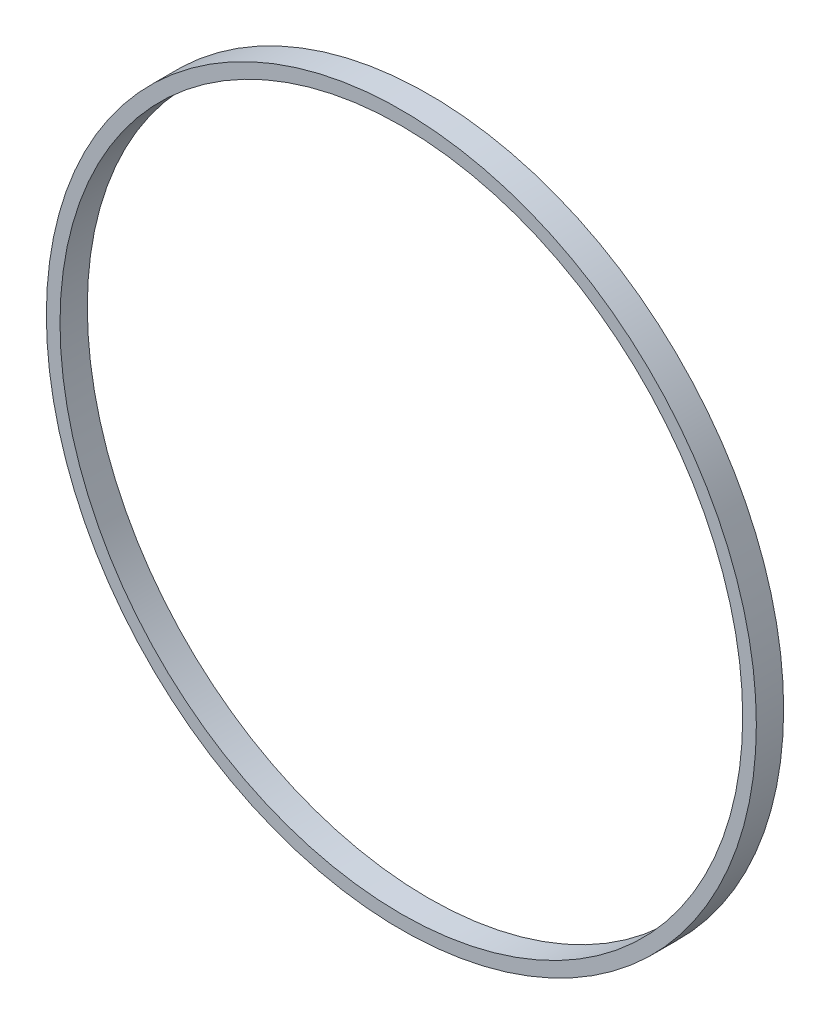
ISO-10303-21;
HEADER;
FILE_DESCRIPTION(('STEP AP214'),'2;1');
FILE_NAME('part.step','',(''),(''),'','','');
FILE_SCHEMA(('AUTOMOTIVE_DESIGN { 1 0 10303 214 1 1 1 1 }'));
ENDSEC;
DATA;
#1=APPLICATION_CONTEXT('core data for automotive mechanical design processes');
#2=APPLICATION_PROTOCOL_DEFINITION('international standard','automotive_design',2000,#1);
#3=PRODUCT_CONTEXT('',#1,'mechanical');
#4=PRODUCT('Part','Part','',(#3));
#5=PRODUCT_RELATED_PRODUCT_CATEGORY('part','',(#4));
#6=PRODUCT_DEFINITION_FORMATION('','',#4);
#7=PRODUCT_DEFINITION_CONTEXT('part definition',#1,'design');
#8=PRODUCT_DEFINITION('design','',#6,#7);
#9=PRODUCT_DEFINITION_SHAPE('','',#8);
#10=(LENGTH_UNIT() NAMED_UNIT(*) SI_UNIT(.MILLI.,.METRE.));
#11=(NAMED_UNIT(*) PLANE_ANGLE_UNIT() SI_UNIT($,.RADIAN.));
#12=(NAMED_UNIT(*) SI_UNIT($,.STERADIAN.) SOLID_ANGLE_UNIT());
#13=UNCERTAINTY_MEASURE_WITH_UNIT(LENGTH_MEASURE(1.E-05),#10,'distance_accuracy_value','');
#14=(GEOMETRIC_REPRESENTATION_CONTEXT(3) GLOBAL_UNCERTAINTY_ASSIGNED_CONTEXT((#13)) GLOBAL_UNIT_ASSIGNED_CONTEXT((#10,
#11,#12)) REPRESENTATION_CONTEXT('',''));
#15=CARTESIAN_POINT('',(0.,0.,0.));
#16=DIRECTION('',(0.,0.,1.));
#17=DIRECTION('',(1.,0.,0.));
#18=AXIS2_PLACEMENT_3D('',#15,#16,#17);
#19=CARTESIAN_POINT('',(0.,0.,5.08));
#20=DIRECTION('',(0.,0.,1.));
#21=DIRECTION('',(1.,0.,0.));
#22=AXIS2_PLACEMENT_3D('',#19,#20,#21);
#23=PLANE('',#22);
#24=CARTESIAN_POINT('',(0.,0.,5.08));
#25=DIRECTION('',(0.,0.,1.));
#26=DIRECTION('',(1.,0.,0.));
#27=AXIS2_PLACEMENT_3D('',#24,#25,#26);
#28=CIRCLE('',#27,66.04);
#29=CARTESIAN_POINT('',(66.04,0.,5.08));
#30=VERTEX_POINT('',#29);
#31=EDGE_CURVE('E10',#30,#30,#28,.T.);
#32=ORIENTED_EDGE('',*,*,#31,.T.);
#33=EDGE_LOOP('',(#32));
#34=FACE_BOUND('',#33,.T.);
#35=CARTESIAN_POINT('',(0.,0.,5.08));
#36=DIRECTION('',(0.,0.,1.));
#37=DIRECTION('',(1.,0.,0.));
#38=AXIS2_PLACEMENT_3D('',#35,#36,#37);
#39=CIRCLE('',#38,63.5);
#40=CARTESIAN_POINT('',(63.5,0.,5.08));
#41=VERTEX_POINT('',#40);
#42=EDGE_CURVE('E45',#41,#41,#39,.T.);
#43=ORIENTED_EDGE('',*,*,#42,.F.);
#44=EDGE_LOOP('',(#43));
#45=FACE_BOUND('',#44,.T.);
#46=ADVANCED_FACE('F34',(#34,#45),#23,.T.);
#47=CARTESIAN_POINT('',(0.,0.,0.));
#48=DIRECTION('',(0.,0.,1.));
#49=DIRECTION('',(1.,0.,0.));
#50=AXIS2_PLACEMENT_3D('',#47,#48,#49);
#51=PLANE('',#50);
#52=CARTESIAN_POINT('',(0.,0.,0.));
#53=DIRECTION('',(0.,0.,1.));
#54=DIRECTION('',(1.,0.,0.));
#55=AXIS2_PLACEMENT_3D('',#52,#53,#54);
#56=CIRCLE('',#55,66.04);
#57=CARTESIAN_POINT('',(66.04,0.,0.));
#58=VERTEX_POINT('',#57);
#59=EDGE_CURVE('E38',#58,#58,#56,.T.);
#60=ORIENTED_EDGE('',*,*,#59,.F.);
#61=EDGE_LOOP('',(#60));
#62=FACE_BOUND('',#61,.T.);
#63=CARTESIAN_POINT('',(0.,0.,0.));
#64=DIRECTION('',(0.,0.,1.));
#65=DIRECTION('',(1.,0.,0.));
#66=AXIS2_PLACEMENT_3D('',#63,#64,#65);
#67=CIRCLE('',#66,63.5);
#68=CARTESIAN_POINT('',(63.5,0.,0.));
#69=VERTEX_POINT('',#68);
#70=EDGE_CURVE('E47',#69,#69,#67,.T.);
#71=ORIENTED_EDGE('',*,*,#70,.T.);
#72=EDGE_LOOP('',(#71));
#73=FACE_BOUND('',#72,.T.);
#74=ADVANCED_FACE('F57',(#62,#73),#51,.F.);
#75=CARTESIAN_POINT('',(0.,0.,5.08));
#76=DIRECTION('',(0.,0.,-1.));
#77=DIRECTION('',(-1.,0.,0.));
#78=AXIS2_PLACEMENT_3D('',#75,#76,#77);
#79=CYLINDRICAL_SURFACE('',#78,66.04);
#80=ORIENTED_EDGE('',*,*,#31,.F.);
#81=EDGE_LOOP('',(#80));
#82=FACE_BOUND('',#81,.T.);
#83=ORIENTED_EDGE('',*,*,#59,.T.);
#84=EDGE_LOOP('',(#83));
#85=FACE_BOUND('',#84,.T.);
#86=ADVANCED_FACE('F36',(#82,#85),#79,.T.);
#87=CARTESIAN_POINT('',(0.,0.,5.08));
#88=DIRECTION('',(0.,0.,-1.));
#89=DIRECTION('',(-1.,0.,0.));
#90=AXIS2_PLACEMENT_3D('',#87,#88,#89);
#91=CYLINDRICAL_SURFACE('',#90,63.5);
#92=ORIENTED_EDGE('',*,*,#42,.T.);
#93=EDGE_LOOP('',(#92));
#94=FACE_BOUND('',#93,.T.);
#95=ORIENTED_EDGE('',*,*,#70,.F.);
#96=EDGE_LOOP('',(#95));
#97=FACE_BOUND('',#96,.T.);
#98=ADVANCED_FACE('F53',(#94,#97),#91,.F.);
#99=CLOSED_SHELL('',(#46,#74,#86,#98));
#100=MANIFOLD_SOLID_BREP('B2',#99);
#101=ADVANCED_BREP_SHAPE_REPRESENTATION('',(#18,#100),#14);
#102=SHAPE_DEFINITION_REPRESENTATION(#9,#101);
ENDSEC;
END-ISO-10303-21;
